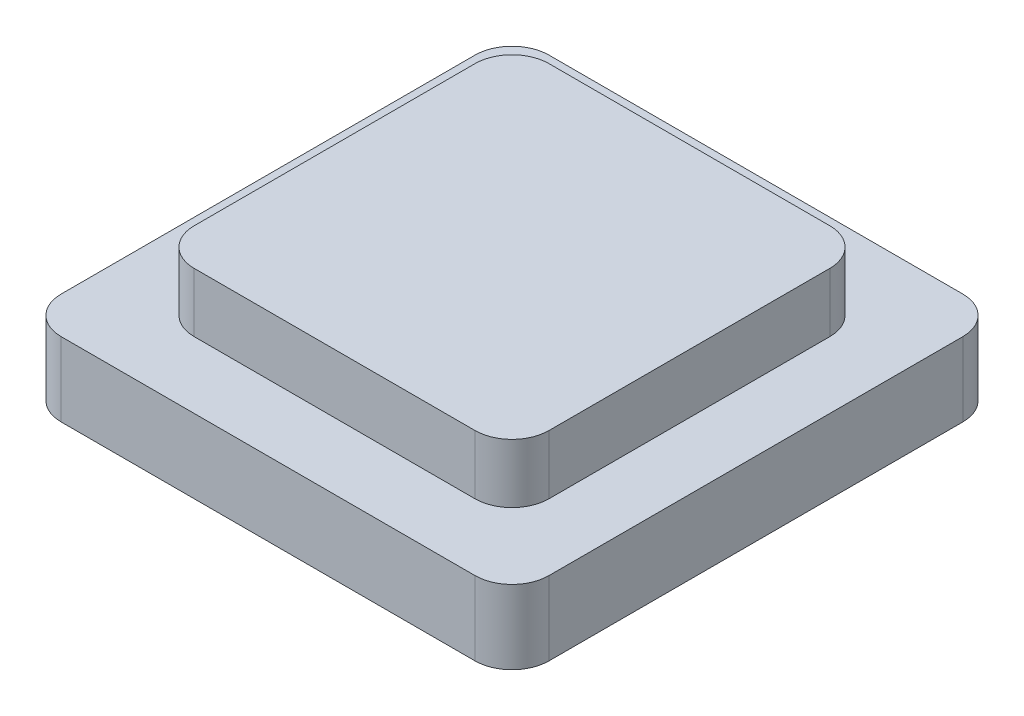
ISO-10303-21;
HEADER;
FILE_DESCRIPTION(('STEP AP214'),'2;1');
FILE_NAME('part.step','',(''),(''),'','','');
FILE_SCHEMA(('AUTOMOTIVE_DESIGN { 1 0 10303 214 1 1 1 1 }'));
ENDSEC;
DATA;
#1=APPLICATION_CONTEXT('core data for automotive mechanical design processes');
#2=APPLICATION_PROTOCOL_DEFINITION('international standard','automotive_design',2000,#1);
#3=PRODUCT_CONTEXT('',#1,'mechanical');
#4=PRODUCT('Part','Part','',(#3));
#5=PRODUCT_RELATED_PRODUCT_CATEGORY('part','',(#4));
#6=PRODUCT_DEFINITION_FORMATION('','',#4);
#7=PRODUCT_DEFINITION_CONTEXT('part definition',#1,'design');
#8=PRODUCT_DEFINITION('design','',#6,#7);
#9=PRODUCT_DEFINITION_SHAPE('','',#8);
#10=(LENGTH_UNIT() NAMED_UNIT(*) SI_UNIT(.MILLI.,.METRE.));
#11=(NAMED_UNIT(*) PLANE_ANGLE_UNIT() SI_UNIT($,.RADIAN.));
#12=(NAMED_UNIT(*) SI_UNIT($,.STERADIAN.) SOLID_ANGLE_UNIT());
#13=UNCERTAINTY_MEASURE_WITH_UNIT(LENGTH_MEASURE(1.E-05),#10,'distance_accuracy_value','');
#14=(GEOMETRIC_REPRESENTATION_CONTEXT(3) GLOBAL_UNCERTAINTY_ASSIGNED_CONTEXT((#13)) GLOBAL_UNIT_ASSIGNED_CONTEXT((#10,
#11,#12)) REPRESENTATION_CONTEXT('',''));
#15=CARTESIAN_POINT('',(0.,0.,0.));
#16=DIRECTION('',(0.,0.,1.));
#17=DIRECTION('',(1.,0.,0.));
#18=AXIS2_PLACEMENT_3D('',#15,#16,#17);
#19=CARTESIAN_POINT('',(-3.8,1.6,3.8));
#20=DIRECTION('',(0.,-1.,0.));
#21=DIRECTION('',(0.,0.,-1.));
#22=AXIS2_PLACEMENT_3D('',#19,#20,#21);
#23=CYLINDRICAL_SURFACE('',#22,1.);
#24=CARTESIAN_POINT('',(-3.8,0.,3.8));
#25=DIRECTION('',(0.,1.,0.));
#26=DIRECTION('',(0.,0.,1.));
#27=AXIS2_PLACEMENT_3D('',#24,#25,#26);
#28=CIRCLE('',#27,1.);
#29=CARTESIAN_POINT('',(-4.8,0.,3.79999999999999));
#30=VERTEX_POINT('',#29);
#31=CARTESIAN_POINT('',(-3.79999999999999,0.,4.8));
#32=VERTEX_POINT('',#31);
#33=EDGE_CURVE('E433',#30,#32,#28,.T.);
#34=ORIENTED_EDGE('',*,*,#33,.T.);
#35=DIRECTION('',(0.,-1.,0.));
#36=VECTOR('',#35,1.);
#37=CARTESIAN_POINT('',(-3.79999999999999,1.6,4.8));
#38=LINE('',#37,#36);
#39=CARTESIAN_POINT('',(-3.79999999999999,1.6,4.8));
#40=VERTEX_POINT('',#39);
#41=EDGE_CURVE('E44',#40,#32,#38,.T.);
#42=ORIENTED_EDGE('',*,*,#41,.F.);
#43=CARTESIAN_POINT('',(-3.8,1.6,3.8));
#44=DIRECTION('',(0.,1.,0.));
#45=DIRECTION('',(0.,0.,1.));
#46=AXIS2_PLACEMENT_3D('',#43,#44,#45);
#47=CIRCLE('',#46,1.);
#48=CARTESIAN_POINT('',(-4.8,1.6,3.79999999999999));
#49=VERTEX_POINT('',#48);
#50=EDGE_CURVE('E434',#49,#40,#47,.T.);
#51=ORIENTED_EDGE('',*,*,#50,.F.);
#52=DIRECTION('',(0.,-1.,0.));
#53=VECTOR('',#52,1.);
#54=CARTESIAN_POINT('',(-4.8,1.6,3.79999999999999));
#55=LINE('',#54,#53);
#56=EDGE_CURVE('E452',#49,#30,#55,.T.);
#57=ORIENTED_EDGE('',*,*,#56,.T.);
#58=EDGE_LOOP('',(#34,#42,#51,#57));
#59=FACE_BOUND('',#58,.T.);
#60=ADVANCED_FACE('F37',(#59),#23,.T.);
#61=CARTESIAN_POINT('',(-3.79999999999999,1.6,4.8));
#62=DIRECTION('',(0.,0.,-1.));
#63=DIRECTION('',(-1.,0.,0.));
#64=AXIS2_PLACEMENT_3D('',#61,#62,#63);
#65=PLANE('',#64);
#66=DIRECTION('',(1.,0.,0.));
#67=VECTOR('',#66,1.);
#68=CARTESIAN_POINT('',(-3.79999999999999,0.,4.8));
#69=LINE('',#68,#67);
#70=CARTESIAN_POINT('',(3.79999999999999,0.,4.8));
#71=VERTEX_POINT('',#70);
#72=EDGE_CURVE('E455',#32,#71,#69,.T.);
#73=ORIENTED_EDGE('',*,*,#72,.T.);
#74=DIRECTION('',(0.,-1.,0.));
#75=VECTOR('',#74,1.);
#76=CARTESIAN_POINT('',(3.79999999999999,1.6,4.8));
#77=LINE('',#76,#75);
#78=CARTESIAN_POINT('',(3.79999999999999,1.6,4.8));
#79=VERTEX_POINT('',#78);
#80=EDGE_CURVE('E492',#79,#71,#77,.T.);
#81=ORIENTED_EDGE('',*,*,#80,.F.);
#82=DIRECTION('',(1.,0.,0.));
#83=VECTOR('',#82,1.);
#84=CARTESIAN_POINT('',(-3.79999999999999,1.6,4.8));
#85=LINE('',#84,#83);
#86=EDGE_CURVE('E437',#40,#79,#85,.T.);
#87=ORIENTED_EDGE('',*,*,#86,.F.);
#88=ORIENTED_EDGE('',*,*,#41,.T.);
#89=EDGE_LOOP('',(#73,#81,#87,#88));
#90=FACE_BOUND('',#89,.T.);
#91=ADVANCED_FACE('F497',(#90),#65,.F.);
#92=CARTESIAN_POINT('',(3.8,1.6,3.8));
#93=DIRECTION('',(0.,-1.,0.));
#94=DIRECTION('',(0.,0.,-1.));
#95=AXIS2_PLACEMENT_3D('',#92,#93,#94);
#96=CYLINDRICAL_SURFACE('',#95,1.);
#97=CARTESIAN_POINT('',(3.8,0.,3.8));
#98=DIRECTION('',(0.,1.,0.));
#99=DIRECTION('',(0.,0.,1.));
#100=AXIS2_PLACEMENT_3D('',#97,#98,#99);
#101=CIRCLE('',#100,1.);
#102=CARTESIAN_POINT('',(4.8,0.,3.79999999999999));
#103=VERTEX_POINT('',#102);
#104=EDGE_CURVE('E458',#71,#103,#101,.T.);
#105=ORIENTED_EDGE('',*,*,#104,.T.);
#106=DIRECTION('',(0.,-1.,0.));
#107=VECTOR('',#106,1.);
#108=CARTESIAN_POINT('',(4.8,1.6,3.79999999999999));
#109=LINE('',#108,#107);
#110=CARTESIAN_POINT('',(4.8,1.6,3.79999999999999));
#111=VERTEX_POINT('',#110);
#112=EDGE_CURVE('E489',#111,#103,#109,.T.);
#113=ORIENTED_EDGE('',*,*,#112,.F.);
#114=CARTESIAN_POINT('',(3.8,1.6,3.8));
#115=DIRECTION('',(0.,1.,0.));
#116=DIRECTION('',(0.,0.,1.));
#117=AXIS2_PLACEMENT_3D('',#114,#115,#116);
#118=CIRCLE('',#117,1.);
#119=EDGE_CURVE('E440',#79,#111,#118,.T.);
#120=ORIENTED_EDGE('',*,*,#119,.F.);
#121=ORIENTED_EDGE('',*,*,#80,.T.);
#122=EDGE_LOOP('',(#105,#113,#120,#121));
#123=FACE_BOUND('',#122,.T.);
#124=ADVANCED_FACE('F527',(#123),#96,.T.);
#125=CARTESIAN_POINT('',(4.8,1.6,-3.79999999999999));
#126=DIRECTION('',(-1.,0.,0.));
#127=DIRECTION('',(0.,0.,1.));
#128=AXIS2_PLACEMENT_3D('',#125,#126,#127);
#129=PLANE('',#128);
#130=DIRECTION('',(0.,0.,-1.));
#131=VECTOR('',#130,1.);
#132=CARTESIAN_POINT('',(4.8,0.,-3.79999999999999));
#133=LINE('',#132,#131);
#134=CARTESIAN_POINT('',(4.8,0.,-3.79999999999999));
#135=VERTEX_POINT('',#134);
#136=EDGE_CURVE('E461',#103,#135,#133,.T.);
#137=ORIENTED_EDGE('',*,*,#136,.T.);
#138=DIRECTION('',(0.,-1.,0.));
#139=VECTOR('',#138,1.);
#140=CARTESIAN_POINT('',(4.8,1.6,-3.79999999999999));
#141=LINE('',#140,#139);
#142=CARTESIAN_POINT('',(4.8,1.6,-3.79999999999999));
#143=VERTEX_POINT('',#142);
#144=EDGE_CURVE('E486',#143,#135,#141,.T.);
#145=ORIENTED_EDGE('',*,*,#144,.F.);
#146=DIRECTION('',(0.,0.,-1.));
#147=VECTOR('',#146,1.);
#148=CARTESIAN_POINT('',(4.8,1.6,-3.79999999999999));
#149=LINE('',#148,#147);
#150=EDGE_CURVE('E442',#111,#143,#149,.T.);
#151=ORIENTED_EDGE('',*,*,#150,.F.);
#152=ORIENTED_EDGE('',*,*,#112,.T.);
#153=EDGE_LOOP('',(#137,#145,#151,#152));
#154=FACE_BOUND('',#153,.T.);
#155=ADVANCED_FACE('F522',(#154),#129,.F.);
#156=CARTESIAN_POINT('',(3.8,1.6,-3.8));
#157=DIRECTION('',(0.,-1.,0.));
#158=DIRECTION('',(0.,0.,-1.));
#159=AXIS2_PLACEMENT_3D('',#156,#157,#158);
#160=CYLINDRICAL_SURFACE('',#159,1.);
#161=CARTESIAN_POINT('',(3.8,0.,-3.8));
#162=DIRECTION('',(0.,1.,0.));
#163=DIRECTION('',(0.,0.,-1.));
#164=AXIS2_PLACEMENT_3D('',#161,#162,#163);
#165=CIRCLE('',#164,1.);
#166=CARTESIAN_POINT('',(3.79999999999999,0.,-4.8));
#167=VERTEX_POINT('',#166);
#168=EDGE_CURVE('E464',#135,#167,#165,.T.);
#169=ORIENTED_EDGE('',*,*,#168,.T.);
#170=DIRECTION('',(0.,-1.,0.));
#171=VECTOR('',#170,1.);
#172=CARTESIAN_POINT('',(3.79999999999999,1.6,-4.8));
#173=LINE('',#172,#171);
#174=CARTESIAN_POINT('',(3.79999999999999,1.6,-4.8));
#175=VERTEX_POINT('',#174);
#176=EDGE_CURVE('E483',#175,#167,#173,.T.);
#177=ORIENTED_EDGE('',*,*,#176,.F.);
#178=CARTESIAN_POINT('',(3.8,1.6,-3.8));
#179=DIRECTION('',(0.,1.,0.));
#180=DIRECTION('',(0.,0.,-1.));
#181=AXIS2_PLACEMENT_3D('',#178,#179,#180);
#182=CIRCLE('',#181,1.);
#183=EDGE_CURVE('E444',#143,#175,#182,.T.);
#184=ORIENTED_EDGE('',*,*,#183,.F.);
#185=ORIENTED_EDGE('',*,*,#144,.T.);
#186=EDGE_LOOP('',(#169,#177,#184,#185));
#187=FACE_BOUND('',#186,.T.);
#188=ADVANCED_FACE('F519',(#187),#160,.T.);
#189=CARTESIAN_POINT('',(-3.79999999999999,1.6,-4.8));
#190=DIRECTION('',(0.,0.,1.));
#191=DIRECTION('',(1.,0.,0.));
#192=AXIS2_PLACEMENT_3D('',#189,#190,#191);
#193=PLANE('',#192);
#194=DIRECTION('',(-1.,0.,0.));
#195=VECTOR('',#194,1.);
#196=CARTESIAN_POINT('',(-3.79999999999999,0.,-4.8));
#197=LINE('',#196,#195);
#198=CARTESIAN_POINT('',(-3.79999999999999,0.,-4.8));
#199=VERTEX_POINT('',#198);
#200=EDGE_CURVE('E467',#167,#199,#197,.T.);
#201=ORIENTED_EDGE('',*,*,#200,.T.);
#202=DIRECTION('',(0.,-1.,0.));
#203=VECTOR('',#202,1.);
#204=CARTESIAN_POINT('',(-3.79999999999999,1.6,-4.8));
#205=LINE('',#204,#203);
#206=CARTESIAN_POINT('',(-3.79999999999999,1.6,-4.8));
#207=VERTEX_POINT('',#206);
#208=EDGE_CURVE('E480',#207,#199,#205,.T.);
#209=ORIENTED_EDGE('',*,*,#208,.F.);
#210=DIRECTION('',(-1.,0.,0.));
#211=VECTOR('',#210,1.);
#212=CARTESIAN_POINT('',(-3.79999999999999,1.6,-4.8));
#213=LINE('',#212,#211);
#214=EDGE_CURVE('E446',#175,#207,#213,.T.);
#215=ORIENTED_EDGE('',*,*,#214,.F.);
#216=ORIENTED_EDGE('',*,*,#176,.T.);
#217=EDGE_LOOP('',(#201,#209,#215,#216));
#218=FACE_BOUND('',#217,.T.);
#219=ADVANCED_FACE('F514',(#218),#193,.F.);
#220=CARTESIAN_POINT('',(-3.8,1.6,-3.8));
#221=DIRECTION('',(0.,-1.,0.));
#222=DIRECTION('',(0.,0.,-1.));
#223=AXIS2_PLACEMENT_3D('',#220,#221,#222);
#224=CYLINDRICAL_SURFACE('',#223,1.);
#225=CARTESIAN_POINT('',(-3.8,0.,-3.8));
#226=DIRECTION('',(0.,1.,0.));
#227=DIRECTION('',(0.,0.,1.));
#228=AXIS2_PLACEMENT_3D('',#225,#226,#227);
#229=CIRCLE('',#228,1.);
#230=CARTESIAN_POINT('',(-4.8,0.,-3.79999999999999));
#231=VERTEX_POINT('',#230);
#232=EDGE_CURVE('E470',#199,#231,#229,.T.);
#233=ORIENTED_EDGE('',*,*,#232,.T.);
#234=DIRECTION('',(0.,-1.,0.));
#235=VECTOR('',#234,1.);
#236=CARTESIAN_POINT('',(-4.8,1.6,-3.79999999999999));
#237=LINE('',#236,#235);
#238=CARTESIAN_POINT('',(-4.8,1.6,-3.79999999999999));
#239=VERTEX_POINT('',#238);
#240=EDGE_CURVE('E477',#239,#231,#237,.T.);
#241=ORIENTED_EDGE('',*,*,#240,.F.);
#242=CARTESIAN_POINT('',(-3.8,1.6,-3.8));
#243=DIRECTION('',(0.,1.,0.));
#244=DIRECTION('',(0.,0.,1.));
#245=AXIS2_PLACEMENT_3D('',#242,#243,#244);
#246=CIRCLE('',#245,1.);
#247=EDGE_CURVE('E448',#207,#239,#246,.T.);
#248=ORIENTED_EDGE('',*,*,#247,.F.);
#249=ORIENTED_EDGE('',*,*,#208,.T.);
#250=EDGE_LOOP('',(#233,#241,#248,#249));
#251=FACE_BOUND('',#250,.T.);
#252=ADVANCED_FACE('F511',(#251),#224,.T.);
#253=CARTESIAN_POINT('',(-4.8,1.6,-3.79999999999999));
#254=DIRECTION('',(1.,0.,0.));
#255=DIRECTION('',(0.,0.,-1.));
#256=AXIS2_PLACEMENT_3D('',#253,#254,#255);
#257=PLANE('',#256);
#258=DIRECTION('',(0.,0.,1.));
#259=VECTOR('',#258,1.);
#260=CARTESIAN_POINT('',(-4.8,0.,-3.79999999999999));
#261=LINE('',#260,#259);
#262=EDGE_CURVE('E438',#231,#30,#261,.T.);
#263=ORIENTED_EDGE('',*,*,#262,.T.);
#264=ORIENTED_EDGE('',*,*,#56,.F.);
#265=DIRECTION('',(0.,0.,1.));
#266=VECTOR('',#265,1.);
#267=CARTESIAN_POINT('',(-4.8,1.6,-3.79999999999999));
#268=LINE('',#267,#266);
#269=EDGE_CURVE('E450',#239,#49,#268,.T.);
#270=ORIENTED_EDGE('',*,*,#269,.F.);
#271=ORIENTED_EDGE('',*,*,#240,.T.);
#272=EDGE_LOOP('',(#263,#264,#270,#271));
#273=FACE_BOUND('',#272,.T.);
#274=ADVANCED_FACE('F506',(#273),#257,.F.);
#275=CARTESIAN_POINT('',(-3.8,1.6,3.8));
#276=DIRECTION('',(0.,1.,0.));
#277=DIRECTION('',(0.,0.,1.));
#278=AXIS2_PLACEMENT_3D('',#275,#276,#277);
#279=PLANE('',#278);
#280=ORIENTED_EDGE('',*,*,#50,.T.);
#281=ORIENTED_EDGE('',*,*,#86,.T.);
#282=ORIENTED_EDGE('',*,*,#119,.T.);
#283=ORIENTED_EDGE('',*,*,#150,.T.);
#284=ORIENTED_EDGE('',*,*,#183,.T.);
#285=ORIENTED_EDGE('',*,*,#214,.T.);
#286=ORIENTED_EDGE('',*,*,#247,.T.);
#287=ORIENTED_EDGE('',*,*,#269,.T.);
#288=EDGE_LOOP('',(#280,#281,#282,#283,#284,#285,#286,#287));
#289=FACE_BOUND('',#288,.T.);
#290=ADVANCED_FACE('F529',(#289),#279,.T.);
#291=CARTESIAN_POINT('',(-5.6,-2.,-5.6));
#292=DIRECTION('',(0.,1.,0.));
#293=DIRECTION('',(0.,0.,1.));
#294=AXIS2_PLACEMENT_3D('',#291,#292,#293);
#295=CYLINDRICAL_SURFACE('',#294,1.);
#296=CARTESIAN_POINT('',(-5.6,0.,-5.6));
#297=DIRECTION('',(0.,-1.,0.));
#298=DIRECTION('',(0.,0.,-1.));
#299=AXIS2_PLACEMENT_3D('',#296,#297,#298);
#300=CIRCLE('',#299,1.);
#301=CARTESIAN_POINT('',(-6.6,0.,-5.6));
#302=VERTEX_POINT('',#301);
#303=CARTESIAN_POINT('',(-5.6,0.,-6.6));
#304=VERTEX_POINT('',#303);
#305=EDGE_CURVE('E375',#302,#304,#300,.T.);
#306=ORIENTED_EDGE('',*,*,#305,.T.);
#307=DIRECTION('',(0.,1.,0.));
#308=VECTOR('',#307,1.);
#309=CARTESIAN_POINT('',(-5.6,-2.,-6.6));
#310=LINE('',#309,#308);
#311=CARTESIAN_POINT('',(-5.6,-2.,-6.6));
#312=VERTEX_POINT('',#311);
#313=EDGE_CURVE('E430',#312,#304,#310,.T.);
#314=ORIENTED_EDGE('',*,*,#313,.F.);
#315=CARTESIAN_POINT('',(-5.6,-2.,-5.6));
#316=DIRECTION('',(0.,-1.,0.));
#317=DIRECTION('',(0.,0.,-1.));
#318=AXIS2_PLACEMENT_3D('',#315,#316,#317);
#319=CIRCLE('',#318,1.);
#320=CARTESIAN_POINT('',(-6.6,-2.,-5.6));
#321=VERTEX_POINT('',#320);
#322=EDGE_CURVE('E376',#321,#312,#319,.T.);
#323=ORIENTED_EDGE('',*,*,#322,.F.);
#324=DIRECTION('',(0.,1.,0.));
#325=VECTOR('',#324,1.);
#326=CARTESIAN_POINT('',(-6.6,-2.,-5.6));
#327=LINE('',#326,#325);
#328=EDGE_CURVE('E394',#321,#302,#327,.T.);
#329=ORIENTED_EDGE('',*,*,#328,.T.);
#330=EDGE_LOOP('',(#306,#314,#323,#329));
#331=FACE_BOUND('',#330,.T.);
#332=ADVANCED_FACE('F531',(#331),#295,.T.);
#333=CARTESIAN_POINT('',(-5.6,-2.,-6.6));
#334=DIRECTION('',(0.,0.,1.));
#335=DIRECTION('',(1.,0.,0.));
#336=AXIS2_PLACEMENT_3D('',#333,#334,#335);
#337=PLANE('',#336);
#338=DIRECTION('',(1.,0.,0.));
#339=VECTOR('',#338,1.);
#340=CARTESIAN_POINT('',(-5.6,0.,-6.6));
#341=LINE('',#340,#339);
#342=CARTESIAN_POINT('',(5.6,0.,-6.6));
#343=VERTEX_POINT('',#342);
#344=EDGE_CURVE('E397',#304,#343,#341,.T.);
#345=ORIENTED_EDGE('',*,*,#344,.T.);
#346=DIRECTION('',(0.,1.,0.));
#347=VECTOR('',#346,1.);
#348=CARTESIAN_POINT('',(5.6,-2.,-6.6));
#349=LINE('',#348,#347);
#350=CARTESIAN_POINT('',(5.6,-2.,-6.6));
#351=VERTEX_POINT('',#350);
#352=EDGE_CURVE('E427',#351,#343,#349,.T.);
#353=ORIENTED_EDGE('',*,*,#352,.F.);
#354=DIRECTION('',(1.,0.,0.));
#355=VECTOR('',#354,1.);
#356=CARTESIAN_POINT('',(-5.6,-2.,-6.6));
#357=LINE('',#356,#355);
#358=EDGE_CURVE('E379',#312,#351,#357,.T.);
#359=ORIENTED_EDGE('',*,*,#358,.F.);
#360=ORIENTED_EDGE('',*,*,#313,.T.);
#361=EDGE_LOOP('',(#345,#353,#359,#360));
#362=FACE_BOUND('',#361,.T.);
#363=ADVANCED_FACE('F537',(#362),#337,.F.);
#364=CARTESIAN_POINT('',(5.6,-2.,-5.6));
#365=DIRECTION('',(0.,1.,0.));
#366=DIRECTION('',(0.,0.,1.));
#367=AXIS2_PLACEMENT_3D('',#364,#365,#366);
#368=CYLINDRICAL_SURFACE('',#367,1.);
#369=CARTESIAN_POINT('',(5.6,0.,-5.6));
#370=DIRECTION('',(0.,-1.,0.));
#371=DIRECTION('',(0.,0.,-1.));
#372=AXIS2_PLACEMENT_3D('',#369,#370,#371);
#373=CIRCLE('',#372,1.);
#374=CARTESIAN_POINT('',(6.6,0.,-5.6));
#375=VERTEX_POINT('',#374);
#376=EDGE_CURVE('E399',#343,#375,#373,.T.);
#377=ORIENTED_EDGE('',*,*,#376,.T.);
#378=DIRECTION('',(0.,1.,0.));
#379=VECTOR('',#378,1.);
#380=CARTESIAN_POINT('',(6.6,-2.,-5.6));
#381=LINE('',#380,#379);
#382=CARTESIAN_POINT('',(6.6,-2.,-5.6));
#383=VERTEX_POINT('',#382);
#384=EDGE_CURVE('E424',#383,#375,#381,.T.);
#385=ORIENTED_EDGE('',*,*,#384,.F.);
#386=CARTESIAN_POINT('',(5.6,-2.,-5.6));
#387=DIRECTION('',(0.,-1.,0.));
#388=DIRECTION('',(0.,0.,-1.));
#389=AXIS2_PLACEMENT_3D('',#386,#387,#388);
#390=CIRCLE('',#389,1.);
#391=EDGE_CURVE('E382',#351,#383,#390,.T.);
#392=ORIENTED_EDGE('',*,*,#391,.F.);
#393=ORIENTED_EDGE('',*,*,#352,.T.);
#394=EDGE_LOOP('',(#377,#385,#392,#393));
#395=FACE_BOUND('',#394,.T.);
#396=ADVANCED_FACE('F581',(#395),#368,.T.);
#397=CARTESIAN_POINT('',(6.6,-2.,5.6));
#398=DIRECTION('',(-1.,0.,0.));
#399=DIRECTION('',(0.,0.,1.));
#400=AXIS2_PLACEMENT_3D('',#397,#398,#399);
#401=PLANE('',#400);
#402=DIRECTION('',(0.,0.,1.));
#403=VECTOR('',#402,1.);
#404=CARTESIAN_POINT('',(6.6,0.,5.6));
#405=LINE('',#404,#403);
#406=CARTESIAN_POINT('',(6.6,0.,5.6));
#407=VERTEX_POINT('',#406);
#408=EDGE_CURVE('E401',#375,#407,#405,.T.);
#409=ORIENTED_EDGE('',*,*,#408,.T.);
#410=DIRECTION('',(0.,1.,0.));
#411=VECTOR('',#410,1.);
#412=CARTESIAN_POINT('',(6.6,-2.,5.6));
#413=LINE('',#412,#411);
#414=CARTESIAN_POINT('',(6.6,-2.,5.6));
#415=VERTEX_POINT('',#414);
#416=EDGE_CURVE('E421',#415,#407,#413,.T.);
#417=ORIENTED_EDGE('',*,*,#416,.F.);
#418=DIRECTION('',(0.,0.,1.));
#419=VECTOR('',#418,1.);
#420=CARTESIAN_POINT('',(6.6,-2.,5.6));
#421=LINE('',#420,#419);
#422=EDGE_CURVE('E384',#383,#415,#421,.T.);
#423=ORIENTED_EDGE('',*,*,#422,.F.);
#424=ORIENTED_EDGE('',*,*,#384,.T.);
#425=EDGE_LOOP('',(#409,#417,#423,#424));
#426=FACE_BOUND('',#425,.T.);
#427=ADVANCED_FACE('F591',(#426),#401,.F.);
#428=CARTESIAN_POINT('',(5.6,-2.,5.6));
#429=DIRECTION('',(0.,1.,0.));
#430=DIRECTION('',(0.,0.,1.));
#431=AXIS2_PLACEMENT_3D('',#428,#429,#430);
#432=CYLINDRICAL_SURFACE('',#431,1.);
#433=CARTESIAN_POINT('',(5.6,0.,5.6));
#434=DIRECTION('',(0.,-1.,0.));
#435=DIRECTION('',(0.,0.,1.));
#436=AXIS2_PLACEMENT_3D('',#433,#434,#435);
#437=CIRCLE('',#436,1.);
#438=CARTESIAN_POINT('',(5.6,0.,6.6));
#439=VERTEX_POINT('',#438);
#440=EDGE_CURVE('E403',#407,#439,#437,.T.);
#441=ORIENTED_EDGE('',*,*,#440,.T.);
#442=DIRECTION('',(0.,1.,0.));
#443=VECTOR('',#442,1.);
#444=CARTESIAN_POINT('',(5.6,-2.,6.6));
#445=LINE('',#444,#443);
#446=CARTESIAN_POINT('',(5.6,-2.,6.6));
#447=VERTEX_POINT('',#446);
#448=EDGE_CURVE('E418',#447,#439,#445,.T.);
#449=ORIENTED_EDGE('',*,*,#448,.F.);
#450=CARTESIAN_POINT('',(5.6,-2.,5.6));
#451=DIRECTION('',(0.,-1.,0.));
#452=DIRECTION('',(0.,0.,1.));
#453=AXIS2_PLACEMENT_3D('',#450,#451,#452);
#454=CIRCLE('',#453,1.);
#455=EDGE_CURVE('E386',#415,#447,#454,.T.);
#456=ORIENTED_EDGE('',*,*,#455,.F.);
#457=ORIENTED_EDGE('',*,*,#416,.T.);
#458=EDGE_LOOP('',(#441,#449,#456,#457));
#459=FACE_BOUND('',#458,.T.);
#460=ADVANCED_FACE('F601',(#459),#432,.T.);
#461=CARTESIAN_POINT('',(-5.6,-2.,6.6));
#462=DIRECTION('',(0.,0.,-1.));
#463=DIRECTION('',(-1.,0.,0.));
#464=AXIS2_PLACEMENT_3D('',#461,#462,#463);
#465=PLANE('',#464);
#466=DIRECTION('',(-1.,0.,0.));
#467=VECTOR('',#466,1.);
#468=CARTESIAN_POINT('',(-5.6,0.,6.6));
#469=LINE('',#468,#467);
#470=CARTESIAN_POINT('',(-5.6,0.,6.6));
#471=VERTEX_POINT('',#470);
#472=EDGE_CURVE('E405',#439,#471,#469,.T.);
#473=ORIENTED_EDGE('',*,*,#472,.T.);
#474=DIRECTION('',(0.,1.,0.));
#475=VECTOR('',#474,1.);
#476=CARTESIAN_POINT('',(-5.6,-2.,6.6));
#477=LINE('',#476,#475);
#478=CARTESIAN_POINT('',(-5.6,-2.,6.6));
#479=VERTEX_POINT('',#478);
#480=EDGE_CURVE('E415',#479,#471,#477,.T.);
#481=ORIENTED_EDGE('',*,*,#480,.F.);
#482=DIRECTION('',(-1.,0.,0.));
#483=VECTOR('',#482,1.);
#484=CARTESIAN_POINT('',(-5.6,-2.,6.6));
#485=LINE('',#484,#483);
#486=EDGE_CURVE('E388',#447,#479,#485,.T.);
#487=ORIENTED_EDGE('',*,*,#486,.F.);
#488=ORIENTED_EDGE('',*,*,#448,.T.);
#489=EDGE_LOOP('',(#473,#481,#487,#488));
#490=FACE_BOUND('',#489,.T.);
#491=ADVANCED_FACE('F611',(#490),#465,.F.);
#492=CARTESIAN_POINT('',(-5.6,-2.,5.6));
#493=DIRECTION('',(0.,1.,0.));
#494=DIRECTION('',(0.,0.,1.));
#495=AXIS2_PLACEMENT_3D('',#492,#493,#494);
#496=CYLINDRICAL_SURFACE('',#495,1.);
#497=CARTESIAN_POINT('',(-5.6,0.,5.6));
#498=DIRECTION('',(0.,-1.,0.));
#499=DIRECTION('',(0.,0.,-1.));
#500=AXIS2_PLACEMENT_3D('',#497,#498,#499);
#501=CIRCLE('',#500,1.);
#502=CARTESIAN_POINT('',(-6.6,0.,5.6));
#503=VERTEX_POINT('',#502);
#504=EDGE_CURVE('E407',#471,#503,#501,.T.);
#505=ORIENTED_EDGE('',*,*,#504,.T.);
#506=DIRECTION('',(0.,1.,0.));
#507=VECTOR('',#506,1.);
#508=CARTESIAN_POINT('',(-6.6,-2.,5.6));
#509=LINE('',#508,#507);
#510=CARTESIAN_POINT('',(-6.6,-2.,5.6));
#511=VERTEX_POINT('',#510);
#512=EDGE_CURVE('E412',#511,#503,#509,.T.);
#513=ORIENTED_EDGE('',*,*,#512,.F.);
#514=CARTESIAN_POINT('',(-5.6,-2.,5.6));
#515=DIRECTION('',(0.,-1.,0.));
#516=DIRECTION('',(0.,0.,-1.));
#517=AXIS2_PLACEMENT_3D('',#514,#515,#516);
#518=CIRCLE('',#517,1.);
#519=EDGE_CURVE('E390',#479,#511,#518,.T.);
#520=ORIENTED_EDGE('',*,*,#519,.F.);
#521=ORIENTED_EDGE('',*,*,#480,.T.);
#522=EDGE_LOOP('',(#505,#513,#520,#521));
#523=FACE_BOUND('',#522,.T.);
#524=ADVANCED_FACE('F621',(#523),#496,.T.);
#525=CARTESIAN_POINT('',(-6.6,-2.,5.6));
#526=DIRECTION('',(1.,0.,0.));
#527=DIRECTION('',(0.,0.,-1.));
#528=AXIS2_PLACEMENT_3D('',#525,#526,#527);
#529=PLANE('',#528);
#530=DIRECTION('',(0.,0.,-1.));
#531=VECTOR('',#530,1.);
#532=CARTESIAN_POINT('',(-6.6,0.,5.6));
#533=LINE('',#532,#531);
#534=EDGE_CURVE('E380',#503,#302,#533,.T.);
#535=ORIENTED_EDGE('',*,*,#534,.T.);
#536=ORIENTED_EDGE('',*,*,#328,.F.);
#537=DIRECTION('',(0.,0.,-1.));
#538=VECTOR('',#537,1.);
#539=CARTESIAN_POINT('',(-6.6,-2.,5.6));
#540=LINE('',#539,#538);
#541=EDGE_CURVE('E392',#511,#321,#540,.T.);
#542=ORIENTED_EDGE('',*,*,#541,.F.);
#543=ORIENTED_EDGE('',*,*,#512,.T.);
#544=EDGE_LOOP('',(#535,#536,#542,#543));
#545=FACE_BOUND('',#544,.T.);
#546=ADVANCED_FACE('F631',(#545),#529,.F.);
#547=CARTESIAN_POINT('',(-5.6,-2.,-5.6));
#548=DIRECTION('',(0.,-1.,0.));
#549=DIRECTION('',(0.,0.,-1.));
#550=AXIS2_PLACEMENT_3D('',#547,#548,#549);
#551=PLANE('',#550);
#552=CARTESIAN_POINT('',(-4.6,-2.,-4.6));
#553=DIRECTION('',(0.,-1.,0.));
#554=DIRECTION('',(0.,0.,-1.));
#555=AXIS2_PLACEMENT_3D('',#552,#553,#554);
#556=CIRCLE('',#555,1.);
#557=CARTESIAN_POINT('',(-5.6,-2.,-4.59999999999999));
#558=VERTEX_POINT('',#557);
#559=CARTESIAN_POINT('',(-4.59999999999999,-2.,-5.6));
#560=VERTEX_POINT('',#559);
#561=EDGE_CURVE('E51',#558,#560,#556,.T.);
#562=ORIENTED_EDGE('',*,*,#561,.F.);
#563=DIRECTION('',(0.,0.,-1.));
#564=VECTOR('',#563,1.);
#565=CARTESIAN_POINT('',(-5.6,-2.,4.59999999999999));
#566=LINE('',#565,#564);
#567=CARTESIAN_POINT('',(-5.6,-2.,4.59999999999999));
#568=VERTEX_POINT('',#567);
#569=EDGE_CURVE('E265',#568,#558,#566,.T.);
#570=ORIENTED_EDGE('',*,*,#569,.F.);
#571=CARTESIAN_POINT('',(-4.6,-2.,4.6));
#572=DIRECTION('',(0.,-1.,0.));
#573=DIRECTION('',(0.,0.,-1.));
#574=AXIS2_PLACEMENT_3D('',#571,#572,#573);
#575=CIRCLE('',#574,1.);
#576=CARTESIAN_POINT('',(-4.59999999999999,-2.,5.6));
#577=VERTEX_POINT('',#576);
#578=EDGE_CURVE('E268',#577,#568,#575,.T.);
#579=ORIENTED_EDGE('',*,*,#578,.F.);
#580=DIRECTION('',(-1.,0.,0.));
#581=VECTOR('',#580,1.);
#582=CARTESIAN_POINT('',(-4.59999999999999,-2.,5.6));
#583=LINE('',#582,#581);
#584=CARTESIAN_POINT('',(4.59999999999999,-2.,5.6));
#585=VERTEX_POINT('',#584);
#586=EDGE_CURVE('E296',#585,#577,#583,.T.);
#587=ORIENTED_EDGE('',*,*,#586,.F.);
#588=CARTESIAN_POINT('',(4.6,-2.,4.6));
#589=DIRECTION('',(0.,-1.,0.));
#590=DIRECTION('',(0.,0.,1.));
#591=AXIS2_PLACEMENT_3D('',#588,#589,#590);
#592=CIRCLE('',#591,1.);
#593=CARTESIAN_POINT('',(5.6,-2.,4.59999999999999));
#594=VERTEX_POINT('',#593);
#595=EDGE_CURVE('E293',#594,#585,#592,.T.);
#596=ORIENTED_EDGE('',*,*,#595,.F.);
#597=DIRECTION('',(0.,0.,1.));
#598=VECTOR('',#597,1.);
#599=CARTESIAN_POINT('',(5.6,-2.,4.59999999999999));
#600=LINE('',#599,#598);
#601=CARTESIAN_POINT('',(5.6,-2.,-4.59999999999999));
#602=VERTEX_POINT('',#601);
#603=EDGE_CURVE('E290',#602,#594,#600,.T.);
#604=ORIENTED_EDGE('',*,*,#603,.F.);
#605=CARTESIAN_POINT('',(4.6,-2.,-4.6));
#606=DIRECTION('',(0.,-1.,0.));
#607=DIRECTION('',(0.,0.,-1.));
#608=AXIS2_PLACEMENT_3D('',#605,#606,#607);
#609=CIRCLE('',#608,1.);
#610=CARTESIAN_POINT('',(4.59999999999999,-2.,-5.6));
#611=VERTEX_POINT('',#610);
#612=EDGE_CURVE('E287',#611,#602,#609,.T.);
#613=ORIENTED_EDGE('',*,*,#612,.F.);
#614=DIRECTION('',(1.,0.,0.));
#615=VECTOR('',#614,1.);
#616=CARTESIAN_POINT('',(-4.59999999999999,-2.,-5.6));
#617=LINE('',#616,#615);
#618=EDGE_CURVE('E285',#560,#611,#617,.T.);
#619=ORIENTED_EDGE('',*,*,#618,.F.);
#620=EDGE_LOOP('',(#562,#570,#579,#587,#596,#604,#613,#619));
#621=FACE_BOUND('',#620,.T.);
#622=ORIENTED_EDGE('',*,*,#322,.T.);
#623=ORIENTED_EDGE('',*,*,#358,.T.);
#624=ORIENTED_EDGE('',*,*,#391,.T.);
#625=ORIENTED_EDGE('',*,*,#422,.T.);
#626=ORIENTED_EDGE('',*,*,#455,.T.);
#627=ORIENTED_EDGE('',*,*,#486,.T.);
#628=ORIENTED_EDGE('',*,*,#519,.T.);
#629=ORIENTED_EDGE('',*,*,#541,.T.);
#630=EDGE_LOOP('',(#622,#623,#624,#625,#626,#627,#628,#629));
#631=FACE_BOUND('',#630,.T.);
#632=ADVANCED_FACE('F641',(#621,#631),#551,.T.);
#633=CARTESIAN_POINT('',(-5.6,0.,-5.6));
#634=DIRECTION('',(0.,-1.,0.));
#635=DIRECTION('',(0.,0.,-1.));
#636=AXIS2_PLACEMENT_3D('',#633,#634,#635);
#637=PLANE('',#636);
#638=ORIENTED_EDGE('',*,*,#33,.F.);
#639=ORIENTED_EDGE('',*,*,#262,.F.);
#640=ORIENTED_EDGE('',*,*,#232,.F.);
#641=ORIENTED_EDGE('',*,*,#200,.F.);
#642=ORIENTED_EDGE('',*,*,#168,.F.);
#643=ORIENTED_EDGE('',*,*,#136,.F.);
#644=ORIENTED_EDGE('',*,*,#104,.F.);
#645=ORIENTED_EDGE('',*,*,#72,.F.);
#646=EDGE_LOOP('',(#638,#639,#640,#641,#642,#643,#644,#645));
#647=FACE_BOUND('',#646,.T.);
#648=ORIENTED_EDGE('',*,*,#305,.F.);
#649=ORIENTED_EDGE('',*,*,#534,.F.);
#650=ORIENTED_EDGE('',*,*,#504,.F.);
#651=ORIENTED_EDGE('',*,*,#472,.F.);
#652=ORIENTED_EDGE('',*,*,#440,.F.);
#653=ORIENTED_EDGE('',*,*,#408,.F.);
#654=ORIENTED_EDGE('',*,*,#376,.F.);
#655=ORIENTED_EDGE('',*,*,#344,.F.);
#656=EDGE_LOOP('',(#648,#649,#650,#651,#652,#653,#654,#655));
#657=FACE_BOUND('',#656,.T.);
#658=ADVANCED_FACE('F503',(#647,#657),#637,.F.);
#659=CARTESIAN_POINT('',(-4.6,-1.,-4.6));
#660=DIRECTION('',(0.,-1.,0.));
#661=DIRECTION('',(0.,0.,-1.));
#662=AXIS2_PLACEMENT_3D('',#659,#660,#661);
#663=PLANE('',#662);
#664=CARTESIAN_POINT('',(-4.6,-1.,-4.6));
#665=DIRECTION('',(0.,-1.,0.));
#666=DIRECTION('',(0.,0.,-1.));
#667=AXIS2_PLACEMENT_3D('',#664,#665,#666);
#668=CIRCLE('',#667,1.);
#669=CARTESIAN_POINT('',(-5.6,-1.,-4.59999999999999));
#670=VERTEX_POINT('',#669);
#671=CARTESIAN_POINT('',(-4.59999999999999,-1.,-5.6));
#672=VERTEX_POINT('',#671);
#673=EDGE_CURVE('E246',#670,#672,#668,.T.);
#674=ORIENTED_EDGE('',*,*,#673,.T.);
#675=DIRECTION('',(1.,0.,0.));
#676=VECTOR('',#675,1.);
#677=CARTESIAN_POINT('',(-4.59999999999999,-1.,-5.6));
#678=LINE('',#677,#676);
#679=CARTESIAN_POINT('',(4.59999999999999,-1.,-5.6));
#680=VERTEX_POINT('',#679);
#681=EDGE_CURVE('E255',#672,#680,#678,.T.);
#682=ORIENTED_EDGE('',*,*,#681,.T.);
#683=CARTESIAN_POINT('',(4.6,-1.,-4.6));
#684=DIRECTION('',(0.,-1.,0.));
#685=DIRECTION('',(0.,0.,-1.));
#686=AXIS2_PLACEMENT_3D('',#683,#684,#685);
#687=CIRCLE('',#686,1.);
#688=CARTESIAN_POINT('',(5.6,-1.,-4.59999999999999));
#689=VERTEX_POINT('',#688);
#690=EDGE_CURVE('E260',#680,#689,#687,.T.);
#691=ORIENTED_EDGE('',*,*,#690,.T.);
#692=DIRECTION('',(0.,0.,1.));
#693=VECTOR('',#692,1.);
#694=CARTESIAN_POINT('',(5.6,-1.,4.59999999999999));
#695=LINE('',#694,#693);
#696=CARTESIAN_POINT('',(5.6,-1.,4.59999999999999));
#697=VERTEX_POINT('',#696);
#698=EDGE_CURVE('E272',#689,#697,#695,.T.);
#699=ORIENTED_EDGE('',*,*,#698,.T.);
#700=CARTESIAN_POINT('',(4.6,-1.,4.6));
#701=DIRECTION('',(0.,-1.,0.));
#702=DIRECTION('',(0.,0.,1.));
#703=AXIS2_PLACEMENT_3D('',#700,#701,#702);
#704=CIRCLE('',#703,1.);
#705=CARTESIAN_POINT('',(4.59999999999999,-1.,5.6));
#706=VERTEX_POINT('',#705);
#707=EDGE_CURVE('E275',#697,#706,#704,.T.);
#708=ORIENTED_EDGE('',*,*,#707,.T.);
#709=DIRECTION('',(-1.,0.,0.));
#710=VECTOR('',#709,1.);
#711=CARTESIAN_POINT('',(-4.59999999999999,-1.,5.6));
#712=LINE('',#711,#710);
#713=CARTESIAN_POINT('',(-4.59999999999999,-1.,5.6));
#714=VERTEX_POINT('',#713);
#715=EDGE_CURVE('E278',#706,#714,#712,.T.);
#716=ORIENTED_EDGE('',*,*,#715,.T.);
#717=CARTESIAN_POINT('',(-4.6,-1.,4.6));
#718=DIRECTION('',(0.,-1.,0.));
#719=DIRECTION('',(0.,0.,-1.));
#720=AXIS2_PLACEMENT_3D('',#717,#718,#719);
#721=CIRCLE('',#720,1.);
#722=CARTESIAN_POINT('',(-5.6,-1.,4.59999999999999));
#723=VERTEX_POINT('',#722);
#724=EDGE_CURVE('E281',#714,#723,#721,.T.);
#725=ORIENTED_EDGE('',*,*,#724,.T.);
#726=DIRECTION('',(0.,0.,-1.));
#727=VECTOR('',#726,1.);
#728=CARTESIAN_POINT('',(-5.6,-1.,4.59999999999999));
#729=LINE('',#728,#727);
#730=EDGE_CURVE('E252',#723,#670,#729,.T.);
#731=ORIENTED_EDGE('',*,*,#730,.T.);
#732=EDGE_LOOP('',(#674,#682,#691,#699,#708,#716,#725,#731));
#733=FACE_BOUND('',#732,.T.);
#734=DIRECTION('',(1.,0.,0.));
#735=VECTOR('',#734,1.);
#736=CARTESIAN_POINT('',(-3.29999999999999,-0.999999999999999,4.3));
#737=LINE('',#736,#735);
#738=CARTESIAN_POINT('',(-3.29999999999999,-0.999999999999999,4.3));
#739=VERTEX_POINT('',#738);
#740=CARTESIAN_POINT('',(3.29999999999999,-0.999999999999999,4.3));
#741=VERTEX_POINT('',#740);
#742=EDGE_CURVE('E58',#739,#741,#737,.T.);
#743=ORIENTED_EDGE('',*,*,#742,.T.);
#744=CARTESIAN_POINT('',(3.3,-0.999999999999999,3.3));
#745=DIRECTION('',(0.,-1.,0.));
#746=DIRECTION('',(0.,0.,-1.));
#747=AXIS2_PLACEMENT_3D('',#744,#745,#746);
#748=CIRCLE('',#747,1.);
#749=CARTESIAN_POINT('',(4.3,-0.999999999999999,3.29999999999999));
#750=VERTEX_POINT('',#749);
#751=EDGE_CURVE('E12',#741,#750,#748,.F.);
#752=ORIENTED_EDGE('',*,*,#751,.T.);
#753=DIRECTION('',(0.,0.,-1.));
#754=VECTOR('',#753,1.);
#755=CARTESIAN_POINT('',(4.3,-0.999999999999999,-3.29999999999999));
#756=LINE('',#755,#754);
#757=CARTESIAN_POINT('',(4.3,-0.999999999999999,-3.29999999999999));
#758=VERTEX_POINT('',#757);
#759=EDGE_CURVE('E303',#750,#758,#756,.T.);
#760=ORIENTED_EDGE('',*,*,#759,.T.);
#761=CARTESIAN_POINT('',(3.3,-0.999999999999999,-3.3));
#762=DIRECTION('',(0.,-1.,0.));
#763=DIRECTION('',(0.,0.,-1.));
#764=AXIS2_PLACEMENT_3D('',#761,#762,#763);
#765=CIRCLE('',#764,1.);
#766=CARTESIAN_POINT('',(3.3,-0.999999999999999,-4.3));
#767=VERTEX_POINT('',#766);
#768=EDGE_CURVE('E316',#758,#767,#765,.F.);
#769=ORIENTED_EDGE('',*,*,#768,.T.);
#770=DIRECTION('',(-1.,0.,0.));
#771=VECTOR('',#770,1.);
#772=CARTESIAN_POINT('',(-3.29999999999999,-0.999999999999999,-4.3));
#773=LINE('',#772,#771);
#774=CARTESIAN_POINT('',(-3.29999999999999,-0.999999999999999,-4.3));
#775=VERTEX_POINT('',#774);
#776=EDGE_CURVE('E318',#767,#775,#773,.T.);
#777=ORIENTED_EDGE('',*,*,#776,.T.);
#778=CARTESIAN_POINT('',(-3.3,-0.999999999999999,-3.3));
#779=DIRECTION('',(0.,-1.,0.));
#780=DIRECTION('',(0.,0.,-1.));
#781=AXIS2_PLACEMENT_3D('',#778,#779,#780);
#782=CIRCLE('',#781,1.);
#783=CARTESIAN_POINT('',(-4.3,-0.999999999999999,-3.29999999999999));
#784=VERTEX_POINT('',#783);
#785=EDGE_CURVE('E320',#775,#784,#782,.F.);
#786=ORIENTED_EDGE('',*,*,#785,.T.);
#787=DIRECTION('',(0.,0.,1.));
#788=VECTOR('',#787,1.);
#789=CARTESIAN_POINT('',(-4.3,-0.999999999999999,-3.29999999999999));
#790=LINE('',#789,#788);
#791=CARTESIAN_POINT('',(-4.3,-0.999999999999999,3.29999999999999));
#792=VERTEX_POINT('',#791);
#793=EDGE_CURVE('E322',#784,#792,#790,.T.);
#794=ORIENTED_EDGE('',*,*,#793,.T.);
#795=CARTESIAN_POINT('',(-3.3,-0.999999999999999,3.3));
#796=DIRECTION('',(0.,-1.,0.));
#797=DIRECTION('',(0.,0.,-1.));
#798=AXIS2_PLACEMENT_3D('',#795,#796,#797);
#799=CIRCLE('',#798,1.);
#800=EDGE_CURVE('E324',#792,#739,#799,.F.);
#801=ORIENTED_EDGE('',*,*,#800,.T.);
#802=EDGE_LOOP('',(#743,#752,#760,#769,#777,#786,#794,#801));
#803=FACE_BOUND('',#802,.T.);
#804=ADVANCED_FACE('F262',(#733,#803),#663,.T.);
#805=CARTESIAN_POINT('',(-4.6,-1.,-4.6));
#806=DIRECTION('',(0.,-1.,0.));
#807=DIRECTION('',(0.,0.,-1.));
#808=AXIS2_PLACEMENT_3D('',#805,#806,#807);
#809=CYLINDRICAL_SURFACE('',#808,1.);
#810=ORIENTED_EDGE('',*,*,#561,.T.);
#811=DIRECTION('',(0.,-1.,0.));
#812=VECTOR('',#811,1.);
#813=CARTESIAN_POINT('',(-4.59999999999999,-1.,-5.6));
#814=LINE('',#813,#812);
#815=EDGE_CURVE('E242',#672,#560,#814,.T.);
#816=ORIENTED_EDGE('',*,*,#815,.F.);
#817=ORIENTED_EDGE('',*,*,#673,.F.);
#818=DIRECTION('',(0.,-1.,0.));
#819=VECTOR('',#818,1.);
#820=CARTESIAN_POINT('',(-5.6,-1.,-4.59999999999999));
#821=LINE('',#820,#819);
#822=EDGE_CURVE('E301',#670,#558,#821,.T.);
#823=ORIENTED_EDGE('',*,*,#822,.T.);
#824=EDGE_LOOP('',(#810,#816,#817,#823));
#825=FACE_BOUND('',#824,.T.);
#826=ADVANCED_FACE('F244',(#825),#809,.F.);
#827=CARTESIAN_POINT('',(-5.6,-1.,4.59999999999999));
#828=DIRECTION('',(-1.,0.,0.));
#829=DIRECTION('',(0.,0.,1.));
#830=AXIS2_PLACEMENT_3D('',#827,#828,#829);
#831=PLANE('',#830);
#832=ORIENTED_EDGE('',*,*,#569,.T.);
#833=ORIENTED_EDGE('',*,*,#822,.F.);
#834=ORIENTED_EDGE('',*,*,#730,.F.);
#835=DIRECTION('',(0.,-1.,0.));
#836=VECTOR('',#835,1.);
#837=CARTESIAN_POINT('',(-5.6,-1.,4.59999999999999));
#838=LINE('',#837,#836);
#839=EDGE_CURVE('E304',#723,#568,#838,.T.);
#840=ORIENTED_EDGE('',*,*,#839,.T.);
#841=EDGE_LOOP('',(#832,#833,#834,#840));
#842=FACE_BOUND('',#841,.T.);
#843=ADVANCED_FACE('F689',(#842),#831,.F.);
#844=CARTESIAN_POINT('',(-4.6,-1.,4.6));
#845=DIRECTION('',(0.,-1.,0.));
#846=DIRECTION('',(0.,0.,-1.));
#847=AXIS2_PLACEMENT_3D('',#844,#845,#846);
#848=CYLINDRICAL_SURFACE('',#847,1.);
#849=ORIENTED_EDGE('',*,*,#578,.T.);
#850=ORIENTED_EDGE('',*,*,#839,.F.);
#851=ORIENTED_EDGE('',*,*,#724,.F.);
#852=DIRECTION('',(0.,-1.,0.));
#853=VECTOR('',#852,1.);
#854=CARTESIAN_POINT('',(-4.59999999999999,-1.,5.6));
#855=LINE('',#854,#853);
#856=EDGE_CURVE('E306',#714,#577,#855,.T.);
#857=ORIENTED_EDGE('',*,*,#856,.T.);
#858=EDGE_LOOP('',(#849,#850,#851,#857));
#859=FACE_BOUND('',#858,.T.);
#860=ADVANCED_FACE('F698',(#859),#848,.F.);
#861=CARTESIAN_POINT('',(-4.59999999999999,-1.,5.6));
#862=DIRECTION('',(0.,0.,1.));
#863=DIRECTION('',(1.,0.,0.));
#864=AXIS2_PLACEMENT_3D('',#861,#862,#863);
#865=PLANE('',#864);
#866=ORIENTED_EDGE('',*,*,#586,.T.);
#867=ORIENTED_EDGE('',*,*,#856,.F.);
#868=ORIENTED_EDGE('',*,*,#715,.F.);
#869=DIRECTION('',(0.,-1.,0.));
#870=VECTOR('',#869,1.);
#871=CARTESIAN_POINT('',(4.59999999999999,-1.,5.6));
#872=LINE('',#871,#870);
#873=EDGE_CURVE('E308',#706,#585,#872,.T.);
#874=ORIENTED_EDGE('',*,*,#873,.T.);
#875=EDGE_LOOP('',(#866,#867,#868,#874));
#876=FACE_BOUND('',#875,.T.);
#877=ADVANCED_FACE('F708',(#876),#865,.F.);
#878=CARTESIAN_POINT('',(4.6,-1.,4.6));
#879=DIRECTION('',(0.,-1.,0.));
#880=DIRECTION('',(0.,0.,-1.));
#881=AXIS2_PLACEMENT_3D('',#878,#879,#880);
#882=CYLINDRICAL_SURFACE('',#881,1.);
#883=ORIENTED_EDGE('',*,*,#595,.T.);
#884=ORIENTED_EDGE('',*,*,#873,.F.);
#885=ORIENTED_EDGE('',*,*,#707,.F.);
#886=DIRECTION('',(0.,-1.,0.));
#887=VECTOR('',#886,1.);
#888=CARTESIAN_POINT('',(5.6,-1.,4.59999999999999));
#889=LINE('',#888,#887);
#890=EDGE_CURVE('E310',#697,#594,#889,.T.);
#891=ORIENTED_EDGE('',*,*,#890,.T.);
#892=EDGE_LOOP('',(#883,#884,#885,#891));
#893=FACE_BOUND('',#892,.T.);
#894=ADVANCED_FACE('F718',(#893),#882,.F.);
#895=CARTESIAN_POINT('',(5.6,-1.,4.59999999999999));
#896=DIRECTION('',(1.,0.,0.));
#897=DIRECTION('',(0.,0.,-1.));
#898=AXIS2_PLACEMENT_3D('',#895,#896,#897);
#899=PLANE('',#898);
#900=ORIENTED_EDGE('',*,*,#603,.T.);
#901=ORIENTED_EDGE('',*,*,#890,.F.);
#902=ORIENTED_EDGE('',*,*,#698,.F.);
#903=DIRECTION('',(0.,-1.,0.));
#904=VECTOR('',#903,1.);
#905=CARTESIAN_POINT('',(5.6,-1.,-4.59999999999999));
#906=LINE('',#905,#904);
#907=EDGE_CURVE('E312',#689,#602,#906,.T.);
#908=ORIENTED_EDGE('',*,*,#907,.T.);
#909=EDGE_LOOP('',(#900,#901,#902,#908));
#910=FACE_BOUND('',#909,.T.);
#911=ADVANCED_FACE('F728',(#910),#899,.F.);
#912=CARTESIAN_POINT('',(4.6,-1.,-4.6));
#913=DIRECTION('',(0.,-1.,0.));
#914=DIRECTION('',(0.,0.,-1.));
#915=AXIS2_PLACEMENT_3D('',#912,#913,#914);
#916=CYLINDRICAL_SURFACE('',#915,1.);
#917=ORIENTED_EDGE('',*,*,#612,.T.);
#918=ORIENTED_EDGE('',*,*,#907,.F.);
#919=ORIENTED_EDGE('',*,*,#690,.F.);
#920=DIRECTION('',(0.,-1.,0.));
#921=VECTOR('',#920,1.);
#922=CARTESIAN_POINT('',(4.59999999999999,-1.,-5.6));
#923=LINE('',#922,#921);
#924=EDGE_CURVE('E251',#680,#611,#923,.T.);
#925=ORIENTED_EDGE('',*,*,#924,.T.);
#926=EDGE_LOOP('',(#917,#918,#919,#925));
#927=FACE_BOUND('',#926,.T.);
#928=ADVANCED_FACE('F738',(#927),#916,.F.);
#929=CARTESIAN_POINT('',(-4.59999999999999,-1.,-5.6));
#930=DIRECTION('',(0.,0.,-1.));
#931=DIRECTION('',(-1.,0.,0.));
#932=AXIS2_PLACEMENT_3D('',#929,#930,#931);
#933=PLANE('',#932);
#934=ORIENTED_EDGE('',*,*,#618,.T.);
#935=ORIENTED_EDGE('',*,*,#924,.F.);
#936=ORIENTED_EDGE('',*,*,#681,.F.);
#937=ORIENTED_EDGE('',*,*,#815,.T.);
#938=EDGE_LOOP('',(#934,#935,#936,#937));
#939=FACE_BOUND('',#938,.T.);
#940=ADVANCED_FACE('F256',(#939),#933,.F.);
#941=CARTESIAN_POINT('',(-3.8,1.1,3.8));
#942=DIRECTION('',(0.,1.,0.));
#943=DIRECTION('',(0.,0.,1.));
#944=AXIS2_PLACEMENT_3D('',#941,#942,#943);
#945=PLANE('',#944);
#946=CARTESIAN_POINT('',(3.3,1.1,3.3));
#947=DIRECTION('',(0.,1.,0.));
#948=DIRECTION('',(0.,0.,1.));
#949=AXIS2_PLACEMENT_3D('',#946,#947,#948);
#950=CIRCLE('',#949,1.);
#951=CARTESIAN_POINT('',(4.3,1.1,3.3));
#952=VERTEX_POINT('',#951);
#953=CARTESIAN_POINT('',(3.29999999999999,1.1,4.3));
#954=VERTEX_POINT('',#953);
#955=EDGE_CURVE('E331',#952,#954,#950,.F.);
#956=ORIENTED_EDGE('',*,*,#955,.T.);
#957=DIRECTION('',(-1.,0.,0.));
#958=VECTOR('',#957,1.);
#959=CARTESIAN_POINT('',(-3.29999999999999,1.1,4.3));
#960=LINE('',#959,#958);
#961=CARTESIAN_POINT('',(-3.29999999999999,1.1,4.3));
#962=VERTEX_POINT('',#961);
#963=EDGE_CURVE('E327',#954,#962,#960,.T.);
#964=ORIENTED_EDGE('',*,*,#963,.T.);
#965=CARTESIAN_POINT('',(-3.3,1.1,3.3));
#966=DIRECTION('',(0.,1.,0.));
#967=DIRECTION('',(0.,0.,1.));
#968=AXIS2_PLACEMENT_3D('',#965,#966,#967);
#969=CIRCLE('',#968,1.);
#970=CARTESIAN_POINT('',(-4.3,1.1,3.29999999999999));
#971=VERTEX_POINT('',#970);
#972=EDGE_CURVE('E356',#962,#971,#969,.F.);
#973=ORIENTED_EDGE('',*,*,#972,.T.);
#974=DIRECTION('',(0.,0.,-1.));
#975=VECTOR('',#974,1.);
#976=CARTESIAN_POINT('',(-4.3,1.1,-3.29999999999999));
#977=LINE('',#976,#975);
#978=CARTESIAN_POINT('',(-4.3,1.1,-3.29999999999999));
#979=VERTEX_POINT('',#978);
#980=EDGE_CURVE('E352',#971,#979,#977,.T.);
#981=ORIENTED_EDGE('',*,*,#980,.T.);
#982=CARTESIAN_POINT('',(-3.3,1.1,-3.3));
#983=DIRECTION('',(0.,1.,0.));
#984=DIRECTION('',(0.,0.,1.));
#985=AXIS2_PLACEMENT_3D('',#982,#983,#984);
#986=CIRCLE('',#985,1.);
#987=CARTESIAN_POINT('',(-3.29999999999999,1.1,-4.3));
#988=VERTEX_POINT('',#987);
#989=EDGE_CURVE('E348',#979,#988,#986,.F.);
#990=ORIENTED_EDGE('',*,*,#989,.T.);
#991=DIRECTION('',(1.,0.,0.));
#992=VECTOR('',#991,1.);
#993=CARTESIAN_POINT('',(-3.29999999999999,1.1,-4.3));
#994=LINE('',#993,#992);
#995=CARTESIAN_POINT('',(3.29999999999999,1.1,-4.3));
#996=VERTEX_POINT('',#995);
#997=EDGE_CURVE('E344',#988,#996,#994,.T.);
#998=ORIENTED_EDGE('',*,*,#997,.T.);
#999=CARTESIAN_POINT('',(3.3,1.1,-3.3));
#1000=DIRECTION('',(0.,1.,0.));
#1001=DIRECTION('',(0.,0.,1.));
#1002=AXIS2_PLACEMENT_3D('',#999,#1000,#1001);
#1003=CIRCLE('',#1002,1.);
#1004=CARTESIAN_POINT('',(4.3,1.1,-3.29999999999999));
#1005=VERTEX_POINT('',#1004);
#1006=EDGE_CURVE('E340',#996,#1005,#1003,.F.);
#1007=ORIENTED_EDGE('',*,*,#1006,.T.);
#1008=DIRECTION('',(0.,0.,1.));
#1009=VECTOR('',#1008,1.);
#1010=CARTESIAN_POINT('',(4.3,1.1,-3.29999999999999));
#1011=LINE('',#1010,#1009);
#1012=EDGE_CURVE('E336',#1005,#952,#1011,.T.);
#1013=ORIENTED_EDGE('',*,*,#1012,.T.);
#1014=EDGE_LOOP('',(#956,#964,#973,#981,#990,#998,#1007,#1013));
#1015=FACE_BOUND('',#1014,.T.);
#1016=ADVANCED_FACE('F659',(#1015),#945,.F.);
#1017=CARTESIAN_POINT('',(3.3,13.7622366364086,3.3));
#1018=DIRECTION('',(0.,-1.,0.));
#1019=DIRECTION('',(0.,0.,-1.));
#1020=AXIS2_PLACEMENT_3D('',#1017,#1018,#1019);
#1021=CYLINDRICAL_SURFACE('',#1020,1.);
#1022=ORIENTED_EDGE('',*,*,#751,.F.);
#1023=DIRECTION('',(0.,-1.,0.));
#1024=VECTOR('',#1023,1.);
#1025=CARTESIAN_POINT('',(3.29999999999999,13.7622366364086,4.3));
#1026=LINE('',#1025,#1024);
#1027=EDGE_CURVE('E334',#954,#741,#1026,.T.);
#1028=ORIENTED_EDGE('',*,*,#1027,.F.);
#1029=ORIENTED_EDGE('',*,*,#955,.F.);
#1030=DIRECTION('',(0.,-1.,0.));
#1031=VECTOR('',#1030,1.);
#1032=CARTESIAN_POINT('',(4.3,13.7622366364086,3.29999999999999));
#1033=LINE('',#1032,#1031);
#1034=EDGE_CURVE('E335',#952,#750,#1033,.T.);
#1035=ORIENTED_EDGE('',*,*,#1034,.T.);
#1036=EDGE_LOOP('',(#1022,#1028,#1029,#1035));
#1037=FACE_BOUND('',#1036,.T.);
#1038=ADVANCED_FACE('F662',(#1037),#1021,.F.);
#1039=CARTESIAN_POINT('',(4.3,13.7622366364086,-3.29999999999999));
#1040=DIRECTION('',(1.,0.,0.));
#1041=DIRECTION('',(0.,0.,-1.));
#1042=AXIS2_PLACEMENT_3D('',#1039,#1040,#1041);
#1043=PLANE('',#1042);
#1044=ORIENTED_EDGE('',*,*,#759,.F.);
#1045=ORIENTED_EDGE('',*,*,#1034,.F.);
#1046=ORIENTED_EDGE('',*,*,#1012,.F.);
#1047=DIRECTION('',(0.,-1.,0.));
#1048=VECTOR('',#1047,1.);
#1049=CARTESIAN_POINT('',(4.3,13.7622366364086,-3.29999999999999));
#1050=LINE('',#1049,#1048);
#1051=EDGE_CURVE('E339',#1005,#758,#1050,.T.);
#1052=ORIENTED_EDGE('',*,*,#1051,.T.);
#1053=EDGE_LOOP('',(#1044,#1045,#1046,#1052));
#1054=FACE_BOUND('',#1053,.T.);
#1055=ADVANCED_FACE('F763',(#1054),#1043,.F.);
#1056=CARTESIAN_POINT('',(3.3,13.7622366364086,-3.3));
#1057=DIRECTION('',(0.,-1.,0.));
#1058=DIRECTION('',(0.,0.,-1.));
#1059=AXIS2_PLACEMENT_3D('',#1056,#1057,#1058);
#1060=CYLINDRICAL_SURFACE('',#1059,1.);
#1061=ORIENTED_EDGE('',*,*,#768,.F.);
#1062=ORIENTED_EDGE('',*,*,#1051,.F.);
#1063=ORIENTED_EDGE('',*,*,#1006,.F.);
#1064=DIRECTION('',(0.,-1.,0.));
#1065=VECTOR('',#1064,1.);
#1066=CARTESIAN_POINT('',(3.29999999999999,13.7622366364086,-4.3));
#1067=LINE('',#1066,#1065);
#1068=EDGE_CURVE('E343',#996,#767,#1067,.T.);
#1069=ORIENTED_EDGE('',*,*,#1068,.T.);
#1070=EDGE_LOOP('',(#1061,#1062,#1063,#1069));
#1071=FACE_BOUND('',#1070,.T.);
#1072=ADVANCED_FACE('F771',(#1071),#1060,.F.);
#1073=CARTESIAN_POINT('',(-3.29999999999999,13.7622366364086,-4.3));
#1074=DIRECTION('',(0.,0.,-1.));
#1075=DIRECTION('',(-1.,0.,0.));
#1076=AXIS2_PLACEMENT_3D('',#1073,#1074,#1075);
#1077=PLANE('',#1076);
#1078=ORIENTED_EDGE('',*,*,#776,.F.);
#1079=ORIENTED_EDGE('',*,*,#1068,.F.);
#1080=ORIENTED_EDGE('',*,*,#997,.F.);
#1081=DIRECTION('',(0.,-1.,0.));
#1082=VECTOR('',#1081,1.);
#1083=CARTESIAN_POINT('',(-3.29999999999999,13.7622366364086,-4.3));
#1084=LINE('',#1083,#1082);
#1085=EDGE_CURVE('E347',#988,#775,#1084,.T.);
#1086=ORIENTED_EDGE('',*,*,#1085,.T.);
#1087=EDGE_LOOP('',(#1078,#1079,#1080,#1086));
#1088=FACE_BOUND('',#1087,.T.);
#1089=ADVANCED_FACE('F780',(#1088),#1077,.F.);
#1090=CARTESIAN_POINT('',(-3.3,13.7622366364086,-3.3));
#1091=DIRECTION('',(0.,-1.,0.));
#1092=DIRECTION('',(0.,0.,-1.));
#1093=AXIS2_PLACEMENT_3D('',#1090,#1091,#1092);
#1094=CYLINDRICAL_SURFACE('',#1093,1.);
#1095=ORIENTED_EDGE('',*,*,#785,.F.);
#1096=ORIENTED_EDGE('',*,*,#1085,.F.);
#1097=ORIENTED_EDGE('',*,*,#989,.F.);
#1098=DIRECTION('',(0.,-1.,0.));
#1099=VECTOR('',#1098,1.);
#1100=CARTESIAN_POINT('',(-4.3,13.7622366364086,-3.29999999999999));
#1101=LINE('',#1100,#1099);
#1102=EDGE_CURVE('E351',#979,#784,#1101,.T.);
#1103=ORIENTED_EDGE('',*,*,#1102,.T.);
#1104=EDGE_LOOP('',(#1095,#1096,#1097,#1103));
#1105=FACE_BOUND('',#1104,.T.);
#1106=ADVANCED_FACE('F789',(#1105),#1094,.F.);
#1107=CARTESIAN_POINT('',(-4.3,13.7622366364086,-3.29999999999999));
#1108=DIRECTION('',(-1.,0.,0.));
#1109=DIRECTION('',(0.,0.,1.));
#1110=AXIS2_PLACEMENT_3D('',#1107,#1108,#1109);
#1111=PLANE('',#1110);
#1112=ORIENTED_EDGE('',*,*,#793,.F.);
#1113=ORIENTED_EDGE('',*,*,#1102,.F.);
#1114=ORIENTED_EDGE('',*,*,#980,.F.);
#1115=DIRECTION('',(0.,-1.,0.));
#1116=VECTOR('',#1115,1.);
#1117=CARTESIAN_POINT('',(-4.3,13.7622366364086,3.29999999999999));
#1118=LINE('',#1117,#1116);
#1119=EDGE_CURVE('E355',#971,#792,#1118,.T.);
#1120=ORIENTED_EDGE('',*,*,#1119,.T.);
#1121=EDGE_LOOP('',(#1112,#1113,#1114,#1120));
#1122=FACE_BOUND('',#1121,.T.);
#1123=ADVANCED_FACE('F798',(#1122),#1111,.F.);
#1124=CARTESIAN_POINT('',(-3.3,13.7622366364086,3.3));
#1125=DIRECTION('',(0.,-1.,0.));
#1126=DIRECTION('',(0.,0.,-1.));
#1127=AXIS2_PLACEMENT_3D('',#1124,#1125,#1126);
#1128=CYLINDRICAL_SURFACE('',#1127,1.);
#1129=ORIENTED_EDGE('',*,*,#800,.F.);
#1130=ORIENTED_EDGE('',*,*,#1119,.F.);
#1131=ORIENTED_EDGE('',*,*,#972,.F.);
#1132=DIRECTION('',(0.,-1.,0.));
#1133=VECTOR('',#1132,1.);
#1134=CARTESIAN_POINT('',(-3.29999999999999,13.7622366364086,4.3));
#1135=LINE('',#1134,#1133);
#1136=EDGE_CURVE('E330',#962,#739,#1135,.T.);
#1137=ORIENTED_EDGE('',*,*,#1136,.T.);
#1138=EDGE_LOOP('',(#1129,#1130,#1131,#1137));
#1139=FACE_BOUND('',#1138,.T.);
#1140=ADVANCED_FACE('F807',(#1139),#1128,.F.);
#1141=CARTESIAN_POINT('',(-3.29999999999999,13.7622366364086,4.3));
#1142=DIRECTION('',(0.,0.,1.));
#1143=DIRECTION('',(1.,0.,0.));
#1144=AXIS2_PLACEMENT_3D('',#1141,#1142,#1143);
#1145=PLANE('',#1144);
#1146=ORIENTED_EDGE('',*,*,#742,.F.);
#1147=ORIENTED_EDGE('',*,*,#1136,.F.);
#1148=ORIENTED_EDGE('',*,*,#963,.F.);
#1149=ORIENTED_EDGE('',*,*,#1027,.T.);
#1150=EDGE_LOOP('',(#1146,#1147,#1148,#1149));
#1151=FACE_BOUND('',#1150,.T.);
#1152=ADVANCED_FACE('F816',(#1151),#1145,.F.);
#1153=CLOSED_SHELL('',(#60,#91,#124,#155,#188,#219,#252,#274,#290,#332,#363,#396,#427,#460,#491,
#524,#546,#632,#658,#804,#826,#843,#860,#877,#894,#911,#928,#940,#1016,#1038,#1055,#1072,#1089,
#1106,#1123,#1140,#1152));
#1154=MANIFOLD_SOLID_BREP('B2',#1153);
#1155=ADVANCED_BREP_SHAPE_REPRESENTATION('',(#18,#1154),#14);
#1156=SHAPE_DEFINITION_REPRESENTATION(#9,#1155);
ENDSEC;
END-ISO-10303-21;
